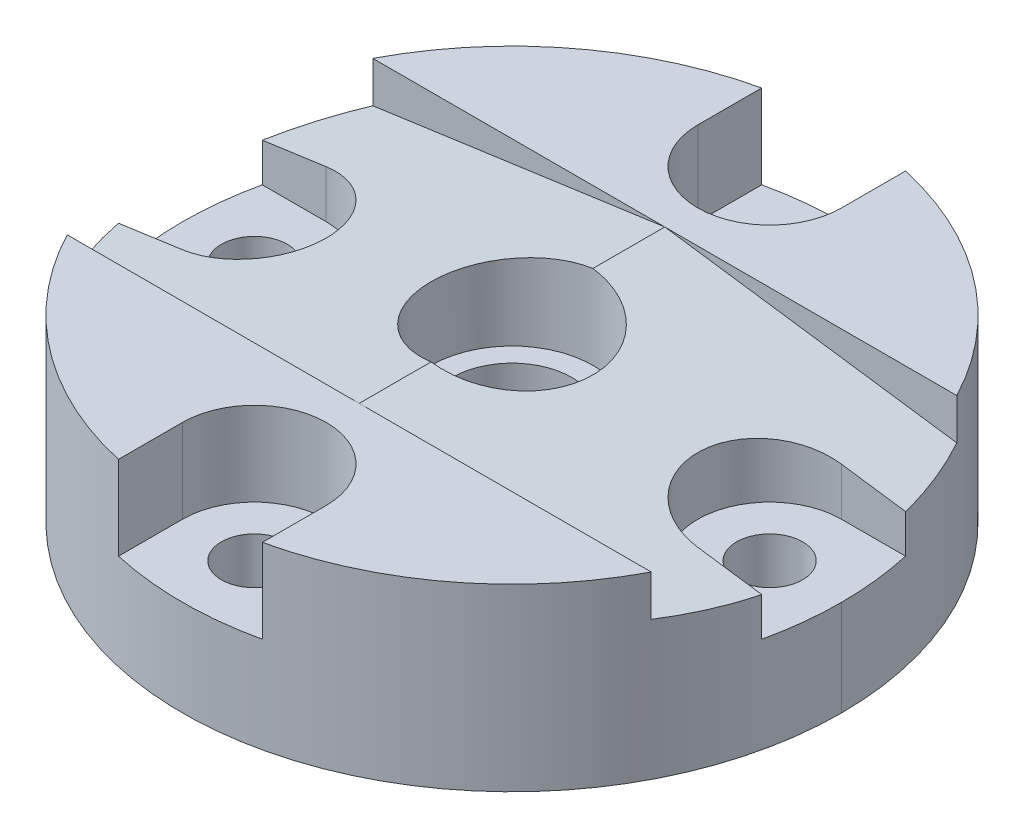
ISO-10303-21;
HEADER;
FILE_DESCRIPTION(('STEP AP214'),'2;1');
FILE_NAME('part.step','',(''),(''),'','','');
FILE_SCHEMA(('AUTOMOTIVE_DESIGN { 1 0 10303 214 1 1 1 1 }'));
ENDSEC;
DATA;
#1=APPLICATION_CONTEXT('core data for automotive mechanical design processes');
#2=APPLICATION_PROTOCOL_DEFINITION('international standard','automotive_design',2000,#1);
#3=PRODUCT_CONTEXT('',#1,'mechanical');
#4=PRODUCT('Part','Part','',(#3));
#5=PRODUCT_RELATED_PRODUCT_CATEGORY('part','',(#4));
#6=PRODUCT_DEFINITION_FORMATION('','',#4);
#7=PRODUCT_DEFINITION_CONTEXT('part definition',#1,'design');
#8=PRODUCT_DEFINITION('design','',#6,#7);
#9=PRODUCT_DEFINITION_SHAPE('','',#8);
#10=(LENGTH_UNIT() NAMED_UNIT(*) SI_UNIT(.MILLI.,.METRE.));
#11=(NAMED_UNIT(*) PLANE_ANGLE_UNIT() SI_UNIT($,.RADIAN.));
#12=(NAMED_UNIT(*) SI_UNIT($,.STERADIAN.) SOLID_ANGLE_UNIT());
#13=UNCERTAINTY_MEASURE_WITH_UNIT(LENGTH_MEASURE(1.E-05),#10,'distance_accuracy_value','');
#14=(GEOMETRIC_REPRESENTATION_CONTEXT(3) GLOBAL_UNCERTAINTY_ASSIGNED_CONTEXT((#13)) GLOBAL_UNIT_ASSIGNED_CONTEXT((#10,
#11,#12)) REPRESENTATION_CONTEXT('',''));
#15=CARTESIAN_POINT('',(0.,0.,0.));
#16=DIRECTION('',(0.,0.,1.));
#17=DIRECTION('',(1.,0.,0.));
#18=AXIS2_PLACEMENT_3D('',#15,#16,#17);
#19=CARTESIAN_POINT('',(3.06925697555866,21.8388981541077,25.5));
#20=DIRECTION('',(0.139173100960058,0.990268068741571,0.));
#21=DIRECTION('',(-0.990268068741571,0.139173100960058,0.));
#22=AXIS2_PLACEMENT_3D('',#19,#20,#21);
#23=PLANE('',#22);
#24=DIRECTION('',(0.,0.,-1.));
#25=VECTOR('',#24,1.);
#26=CARTESIAN_POINT('',(-55.,30.,25.5));
#27=LINE('',#26,#25);
#28=CARTESIAN_POINT('',(-55.,30.,-13.4999999999997));
#29=VERTEX_POINT('',#28);
#30=CARTESIAN_POINT('',(-55.,30.,-25.5));
#31=VERTEX_POINT('',#30);
#32=EDGE_CURVE('E245',#29,#31,#27,.T.);
#33=ORIENTED_EDGE('',*,*,#32,.F.);
#34=CARTESIAN_POINT('',(-55.,30.,3.02131005399295E-13));
#35=DIRECTION('',(0.139173100960058,0.990268068741571,0.));
#36=DIRECTION('',(0.990268068741571,-0.139173100960058,0.));
#37=AXIS2_PLACEMENT_3D('',#34,#35,#36);
#38=ELLIPSE('',#37,13.6326722290013,13.5);
#39=CARTESIAN_POINT('',(-54.9999999999999,30.,13.5000000000003));
#40=VERTEX_POINT('',#39);
#41=EDGE_CURVE('E90',#29,#40,#38,.F.);
#42=ORIENTED_EDGE('',*,*,#41,.T.);
#43=CARTESIAN_POINT('',(-55.,30.,25.5));
#44=VERTEX_POINT('',#43);
#45=EDGE_CURVE('E242',#44,#40,#27,.T.);
#46=ORIENTED_EDGE('',*,*,#45,.F.);
#47=DIRECTION('',(0.990268068741571,-0.139173100960058,0.));
#48=VECTOR('',#47,1.);
#49=CARTESIAN_POINT('',(3.06925697555866,21.8388981541077,25.5));
#50=LINE('',#49,#48);
#51=CARTESIAN_POINT('',(-6.26859328933752,23.1512474246621,25.5));
#52=VERTEX_POINT('',#51);
#53=EDGE_CURVE('E413',#44,#52,#50,.T.);
#54=ORIENTED_EDGE('',*,*,#53,.T.);
#55=CARTESIAN_POINT('',(-55.,30.,0.));
#56=DIRECTION('',(0.139173100960058,0.990268068741571,0.));
#57=DIRECTION('',(-0.990268068741571,0.139173100960058,0.));
#58=AXIS2_PLACEMENT_3D('',#55,#56,#57);
#59=ELLIPSE('',#58,55.5405164885239,55.);
#60=CARTESIAN_POINT('',(-1.3250523987214,22.4564780615096,11.9999999999998));
#61=VERTEX_POINT('',#60);
#62=EDGE_CURVE('E253',#61,#52,#59,.F.);
#63=ORIENTED_EDGE('',*,*,#62,.F.);
#64=DIRECTION('',(0.990268068741571,-0.139173100960058,0.));
#65=VECTOR('',#64,1.);
#66=CARTESIAN_POINT('',(3.06925697555864,21.8388981541077,11.9999999999998));
#67=LINE('',#66,#65);
#68=CARTESIAN_POINT('',(-12.,23.9567441077975,11.9999999999998));
#69=VERTEX_POINT('',#68);
#70=EDGE_CURVE('E289',#69,#61,#67,.T.);
#71=ORIENTED_EDGE('',*,*,#70,.F.);
#72=CARTESIAN_POINT('',(-12.,23.9567441077975,-1.66533453693773E-13));
#73=DIRECTION('',(0.139173100960058,0.990268068741571,0.));
#74=DIRECTION('',(-0.990268068741571,0.139173100960058,0.));
#75=AXIS2_PLACEMENT_3D('',#72,#73,#74);
#76=ELLIPSE('',#75,12.1179308702234,12.);
#77=CARTESIAN_POINT('',(-12.,23.9567441077975,-12.0000000000001));
#78=VERTEX_POINT('',#77);
#79=EDGE_CURVE('E287',#78,#69,#76,.T.);
#80=ORIENTED_EDGE('',*,*,#79,.F.);
#81=DIRECTION('',(-0.990268068741571,0.139173100960058,0.));
#82=VECTOR('',#81,1.);
#83=CARTESIAN_POINT('',(3.06925697555862,21.8388981541077,-12.0000000000002));
#84=LINE('',#83,#82);
#85=CARTESIAN_POINT('',(-1.32505239872145,22.4564780615096,-12.0000000000001));
#86=VERTEX_POINT('',#85);
#87=EDGE_CURVE('E291',#86,#78,#84,.T.);
#88=ORIENTED_EDGE('',*,*,#87,.F.);
#89=CARTESIAN_POINT('',(-55.,30.,0.));
#90=DIRECTION('',(-0.139173100960058,-0.990268068741571,0.));
#91=DIRECTION('',(-0.990268068741571,0.139173100960058,0.));
#92=AXIS2_PLACEMENT_3D('',#89,#90,#91);
#93=ELLIPSE('',#92,55.5405164885239,55.);
#94=CARTESIAN_POINT('',(-6.26859328933752,23.1512474246621,-25.5));
#95=VERTEX_POINT('',#94);
#96=EDGE_CURVE('E403',#86,#95,#93,.F.);
#97=ORIENTED_EDGE('',*,*,#96,.T.);
#98=DIRECTION('',(0.990268068741571,-0.139173100960058,0.));
#99=VECTOR('',#98,1.);
#100=CARTESIAN_POINT('',(3.06925697555866,21.8388981541077,-25.5));
#101=LINE('',#100,#99);
#102=EDGE_CURVE('E394',#31,#95,#101,.T.);
#103=ORIENTED_EDGE('',*,*,#102,.F.);
#104=EDGE_LOOP('',(#33,#42,#46,#54,#63,#71,#80,#88,#97,#103));
#105=FACE_BOUND('',#104,.T.);
#106=ADVANCED_FACE('F75',(#105),#23,.T.);
#107=CARTESIAN_POINT('',(-5.1998636989509,36.9989527240419,25.5));
#108=DIRECTION('',(-0.139173100960058,0.990268068741571,0.));
#109=DIRECTION('',(-0.990268068741571,-0.139173100960058,0.));
#110=AXIS2_PLACEMENT_3D('',#107,#108,#109);
#111=PLANE('',#110);
#112=ORIENTED_EDGE('',*,*,#45,.T.);
#113=CARTESIAN_POINT('',(-55.,30.,3.02131005399295E-13));
#114=DIRECTION('',(-0.139173100960058,0.990268068741571,0.));
#115=DIRECTION('',(-0.990268068741571,-0.139173100960058,0.));
#116=AXIS2_PLACEMENT_3D('',#113,#114,#115);
#117=ELLIPSE('',#116,13.6326722290013,13.5);
#118=EDGE_CURVE('E12',#40,#29,#117,.F.);
#119=ORIENTED_EDGE('',*,*,#118,.T.);
#120=ORIENTED_EDGE('',*,*,#32,.T.);
#121=DIRECTION('',(0.990268068741571,0.139173100960058,0.));
#122=VECTOR('',#121,1.);
#123=CARTESIAN_POINT('',(-5.1998636989509,36.9989527240419,-25.5));
#124=LINE('',#123,#122);
#125=CARTESIAN_POINT('',(-103.731406710662,23.1512474246621,-25.5));
#126=VERTEX_POINT('',#125);
#127=EDGE_CURVE('E382',#126,#31,#124,.T.);
#128=ORIENTED_EDGE('',*,*,#127,.F.);
#129=CARTESIAN_POINT('',(-55.,30.,0.));
#130=DIRECTION('',(0.139173100960058,-0.990268068741571,0.));
#131=DIRECTION('',(0.990268068741571,0.139173100960058,0.));
#132=AXIS2_PLACEMENT_3D('',#129,#130,#131);
#133=ELLIPSE('',#132,55.5405164885239,55.);
#134=CARTESIAN_POINT('',(-108.674947601279,22.4564780615096,-11.9999999999993));
#135=VERTEX_POINT('',#134);
#136=EDGE_CURVE('E388',#126,#135,#133,.F.);
#137=ORIENTED_EDGE('',*,*,#136,.T.);
#138=DIRECTION('',(-0.990268068741571,-0.139173100960058,0.));
#139=VECTOR('',#138,1.);
#140=CARTESIAN_POINT('',(-5.19986369895145,36.9989527240418,-12.0000000000009));
#141=LINE('',#140,#139);
#142=CARTESIAN_POINT('',(-98.0000000000001,23.9567441077975,-11.9999999999995));
#143=VERTEX_POINT('',#142);
#144=EDGE_CURVE('E285',#143,#135,#141,.T.);
#145=ORIENTED_EDGE('',*,*,#144,.F.);
#146=CARTESIAN_POINT('',(-98.,23.9567441077975,4.78783679369599E-13));
#147=DIRECTION('',(-0.139173100960058,0.990268068741571,0.));
#148=DIRECTION('',(0.990268068741571,0.139173100960058,0.));
#149=AXIS2_PLACEMENT_3D('',#146,#147,#148);
#150=ELLIPSE('',#149,12.1179308702234,12.);
#151=CARTESIAN_POINT('',(-97.9999999999999,23.9567441077975,12.0000000000005));
#152=VERTEX_POINT('',#151);
#153=EDGE_CURVE('E283',#152,#143,#150,.T.);
#154=ORIENTED_EDGE('',*,*,#153,.F.);
#155=DIRECTION('',(0.990268068741571,0.139173100960058,0.));
#156=VECTOR('',#155,1.);
#157=CARTESIAN_POINT('',(-5.19986369895108,36.9989527240419,11.9999999999992));
#158=LINE('',#157,#156);
#159=CARTESIAN_POINT('',(-108.674947601278,22.4564780615096,12.0000000000006));
#160=VERTEX_POINT('',#159);
#161=EDGE_CURVE('E281',#160,#152,#158,.T.);
#162=ORIENTED_EDGE('',*,*,#161,.F.);
#163=CARTESIAN_POINT('',(-55.,30.,0.));
#164=DIRECTION('',(-0.139173100960058,0.990268068741571,0.));
#165=DIRECTION('',(0.990268068741571,0.139173100960058,0.));
#166=AXIS2_PLACEMENT_3D('',#163,#164,#165);
#167=ELLIPSE('',#166,55.5405164885239,55.);
#168=CARTESIAN_POINT('',(-103.731406710662,23.1512474246621,25.5));
#169=VERTEX_POINT('',#168);
#170=EDGE_CURVE('E408',#169,#160,#167,.F.);
#171=ORIENTED_EDGE('',*,*,#170,.F.);
#172=DIRECTION('',(0.990268068741571,0.139173100960058,0.));
#173=VECTOR('',#172,1.);
#174=CARTESIAN_POINT('',(-5.1998636989509,36.9989527240419,25.5));
#175=LINE('',#174,#173);
#176=EDGE_CURVE('E252',#169,#44,#175,.T.);
#177=ORIENTED_EDGE('',*,*,#176,.T.);
#178=EDGE_LOOP('',(#112,#119,#120,#128,#137,#145,#154,#162,#171,#177));
#179=FACE_BOUND('',#178,.T.);
#180=ADVANCED_FACE('F250',(#179),#111,.T.);
#181=CARTESIAN_POINT('',(0.,30.,-55.));
#182=DIRECTION('',(0.,1.,0.));
#183=DIRECTION('',(-1.,0.,0.));
#184=AXIS2_PLACEMENT_3D('',#181,#182,#183);
#185=PLANE('',#184);
#186=DIRECTION('',(0.,0.,-1.));
#187=VECTOR('',#186,1.);
#188=CARTESIAN_POINT('',(-43.0000000000005,30.,-55.0000000000001));
#189=LINE('',#188,#187);
#190=CARTESIAN_POINT('',(-43.0000000000003,30.,-43.0000000000001));
#191=VERTEX_POINT('',#190);
#192=CARTESIAN_POINT('',(-43.0000000000004,30.,-53.6749476012787));
#193=VERTEX_POINT('',#192);
#194=EDGE_CURVE('E312',#191,#193,#189,.T.);
#195=ORIENTED_EDGE('',*,*,#194,.F.);
#196=CARTESIAN_POINT('',(-55.0000000000003,30.,-43.));
#197=DIRECTION('',(0.,1.,0.));
#198=DIRECTION('',(-1.,0.,0.));
#199=AXIS2_PLACEMENT_3D('',#196,#197,#198);
#200=CIRCLE('',#199,12.);
#201=CARTESIAN_POINT('',(-67.0000000000003,30.,-42.9999999999999));
#202=VERTEX_POINT('',#201);
#203=EDGE_CURVE('E329',#202,#191,#200,.T.);
#204=ORIENTED_EDGE('',*,*,#203,.F.);
#205=DIRECTION('',(0.,0.,1.));
#206=VECTOR('',#205,1.);
#207=CARTESIAN_POINT('',(-67.0000000000004,30.,-54.9999999999999));
#208=LINE('',#207,#206);
#209=CARTESIAN_POINT('',(-67.0000000000004,30.,-53.6749476012785));
#210=VERTEX_POINT('',#209);
#211=EDGE_CURVE('E482',#210,#202,#208,.T.);
#212=ORIENTED_EDGE('',*,*,#211,.F.);
#213=CARTESIAN_POINT('',(-55.,30.,0.));
#214=DIRECTION('',(0.,1.,0.));
#215=DIRECTION('',(-1.,0.,0.));
#216=AXIS2_PLACEMENT_3D('',#213,#214,#215);
#217=CIRCLE('',#216,55.);
#218=CARTESIAN_POINT('',(-103.731406710662,30.,-25.5));
#219=VERTEX_POINT('',#218);
#220=EDGE_CURVE('E277',#210,#219,#217,.T.);
#221=ORIENTED_EDGE('',*,*,#220,.T.);
#222=DIRECTION('',(1.,0.,0.));
#223=VECTOR('',#222,1.);
#224=CARTESIAN_POINT('',(0.,30.,-25.5));
#225=LINE('',#224,#223);
#226=EDGE_CURVE('E385',#219,#31,#225,.T.);
#227=ORIENTED_EDGE('',*,*,#226,.T.);
#228=DIRECTION('',(1.,0.,0.));
#229=VECTOR('',#228,1.);
#230=CARTESIAN_POINT('',(0.,30.,-25.5));
#231=LINE('',#230,#229);
#232=CARTESIAN_POINT('',(-6.26859328933752,30.,-25.5));
#233=VERTEX_POINT('',#232);
#234=EDGE_CURVE('E397',#31,#233,#231,.T.);
#235=ORIENTED_EDGE('',*,*,#234,.T.);
#236=EDGE_CURVE('E278',#233,#193,#217,.T.);
#237=ORIENTED_EDGE('',*,*,#236,.T.);
#238=EDGE_LOOP('',(#195,#204,#212,#221,#227,#235,#237));
#239=FACE_BOUND('',#238,.T.);
#240=ADVANCED_FACE('F449',(#239),#185,.T.);
#241=CARTESIAN_POINT('',(-55.,0.,0.));
#242=DIRECTION('',(0.,1.,0.));
#243=DIRECTION('',(0.,0.,1.));
#244=AXIS2_PLACEMENT_3D('',#241,#242,#243);
#245=CYLINDRICAL_SURFACE('',#244,55.);
#246=DIRECTION('',(0.,1.,0.));
#247=VECTOR('',#246,1.);
#248=CARTESIAN_POINT('',(-43.0000000000004,0.,-53.6749476012787));
#249=LINE('',#248,#247);
#250=CARTESIAN_POINT('',(-43.0000000000004,16.,-53.6749476012787));
#251=VERTEX_POINT('',#250);
#252=EDGE_CURVE('E84',#193,#251,#249,.F.);
#253=ORIENTED_EDGE('',*,*,#252,.F.);
#254=ORIENTED_EDGE('',*,*,#236,.F.);
#255=DIRECTION('',(0.,1.,0.));
#256=VECTOR('',#255,1.);
#257=CARTESIAN_POINT('',(-6.26859328933752,0.,-25.5));
#258=LINE('',#257,#256);
#259=EDGE_CURVE('E400',#233,#95,#258,.F.);
#260=ORIENTED_EDGE('',*,*,#259,.T.);
#261=ORIENTED_EDGE('',*,*,#96,.F.);
#262=DIRECTION('',(0.,1.,0.));
#263=VECTOR('',#262,1.);
#264=CARTESIAN_POINT('',(-1.32505239872147,0.,-12.0000000000001));
#265=LINE('',#264,#263);
#266=CARTESIAN_POINT('',(-1.32505239872147,16.,-12.0000000000001));
#267=VERTEX_POINT('',#266);
#268=EDGE_CURVE('E370',#267,#86,#265,.T.);
#269=ORIENTED_EDGE('',*,*,#268,.F.);
#270=CARTESIAN_POINT('',(-55.,16.,0.));
#271=DIRECTION('',(0.,-1.,0.));
#272=DIRECTION('',(1.,0.,0.));
#273=AXIS2_PLACEMENT_3D('',#270,#271,#272);
#274=CIRCLE('',#273,55.);
#275=CARTESIAN_POINT('',(0.,16.,-1.74917950494328E-13));
#276=VERTEX_POINT('',#275);
#277=EDGE_CURVE('E380',#276,#267,#274,.F.);
#278=ORIENTED_EDGE('',*,*,#277,.F.);
#279=DIRECTION('',(0.,1.,0.));
#280=VECTOR('',#279,1.);
#281=CARTESIAN_POINT('',(0.,0.,0.));
#282=LINE('',#281,#280);
#283=CARTESIAN_POINT('',(0.,0.,0.));
#284=VERTEX_POINT('',#283);
#285=EDGE_CURVE('E263',#284,#276,#282,.T.);
#286=ORIENTED_EDGE('',*,*,#285,.F.);
#287=CARTESIAN_POINT('',(-55.,0.,0.));
#288=DIRECTION('',(0.,1.,0.));
#289=DIRECTION('',(0.,0.,1.));
#290=AXIS2_PLACEMENT_3D('',#287,#288,#289);
#291=CIRCLE('',#290,55.);
#292=CARTESIAN_POINT('',(-110.,0.,0.));
#293=VERTEX_POINT('',#292);
#294=EDGE_CURVE('E275',#293,#284,#291,.F.);
#295=ORIENTED_EDGE('',*,*,#294,.F.);
#296=DIRECTION('',(0.,-1.,0.));
#297=VECTOR('',#296,1.);
#298=CARTESIAN_POINT('',(-110.,0.,0.));
#299=LINE('',#298,#297);
#300=CARTESIAN_POINT('',(-110.,16.,6.04262010798589E-13));
#301=VERTEX_POINT('',#300);
#302=EDGE_CURVE('E266',#301,#293,#299,.T.);
#303=ORIENTED_EDGE('',*,*,#302,.F.);
#304=CARTESIAN_POINT('',(-55.,16.,0.));
#305=DIRECTION('',(0.,1.,0.));
#306=DIRECTION('',(-1.,0.,0.));
#307=AXIS2_PLACEMENT_3D('',#304,#305,#306);
#308=CIRCLE('',#307,55.);
#309=CARTESIAN_POINT('',(-108.674947601279,16.,-11.9999999999993));
#310=VERTEX_POINT('',#309);
#311=EDGE_CURVE('E377',#301,#310,#308,.F.);
#312=ORIENTED_EDGE('',*,*,#311,.T.);
#313=DIRECTION('',(0.,1.,0.));
#314=VECTOR('',#313,1.);
#315=CARTESIAN_POINT('',(-108.674947601279,0.,-11.9999999999993));
#316=LINE('',#315,#314);
#317=EDGE_CURVE('E365',#135,#310,#316,.F.);
#318=ORIENTED_EDGE('',*,*,#317,.F.);
#319=ORIENTED_EDGE('',*,*,#136,.F.);
#320=DIRECTION('',(0.,1.,0.));
#321=VECTOR('',#320,1.);
#322=CARTESIAN_POINT('',(-103.731406710662,0.,-25.5));
#323=LINE('',#322,#321);
#324=EDGE_CURVE('E391',#126,#219,#323,.T.);
#325=ORIENTED_EDGE('',*,*,#324,.T.);
#326=ORIENTED_EDGE('',*,*,#220,.F.);
#327=DIRECTION('',(0.,1.,0.));
#328=VECTOR('',#327,1.);
#329=CARTESIAN_POINT('',(-67.0000000000004,0.,-53.6749476012785));
#330=LINE('',#329,#328);
#331=CARTESIAN_POINT('',(-67.0000000000004,16.,-53.6749476012785));
#332=VERTEX_POINT('',#331);
#333=EDGE_CURVE('E307',#332,#210,#330,.T.);
#334=ORIENTED_EDGE('',*,*,#333,.F.);
#335=CARTESIAN_POINT('',(-55.,16.,0.));
#336=DIRECTION('',(0.,1.,0.));
#337=DIRECTION('',(-1.,0.,0.));
#338=AXIS2_PLACEMENT_3D('',#335,#336,#337);
#339=CIRCLE('',#338,55.);
#340=EDGE_CURVE('E304',#332,#251,#339,.F.);
#341=ORIENTED_EDGE('',*,*,#340,.T.);
#342=EDGE_LOOP('',(#253,#254,#260,#261,#269,#278,#286,#295,#303,#312,#318,#319,#325,#326,#334,#341));
#343=FACE_BOUND('',#342,.T.);
#344=ADVANCED_FACE('F78',(#343),#245,.T.);
#345=CARTESIAN_POINT('',(-55.,30.,0.));
#346=DIRECTION('',(0.,1.,0.));
#347=DIRECTION('',(0.,0.,1.));
#348=AXIS2_PLACEMENT_3D('',#345,#346,#347);
#349=CYLINDRICAL_SURFACE('',#348,55.);
#350=DIRECTION('',(0.,1.,0.));
#351=VECTOR('',#350,1.);
#352=CARTESIAN_POINT('',(-67.,30.,53.6749476012786));
#353=LINE('',#352,#351);
#354=CARTESIAN_POINT('',(-67.,30.,53.6749476012786));
#355=VERTEX_POINT('',#354);
#356=CARTESIAN_POINT('',(-67.,16.,53.6749476012786));
#357=VERTEX_POINT('',#356);
#358=EDGE_CURVE('E374',#355,#357,#353,.F.);
#359=ORIENTED_EDGE('',*,*,#358,.F.);
#360=CARTESIAN_POINT('',(-55.,30.,0.));
#361=DIRECTION('',(0.,-1.,0.));
#362=DIRECTION('',(1.,0.,0.));
#363=AXIS2_PLACEMENT_3D('',#360,#361,#362);
#364=CIRCLE('',#363,55.);
#365=CARTESIAN_POINT('',(-103.731406710662,30.,25.5));
#366=VERTEX_POINT('',#365);
#367=EDGE_CURVE('E269',#366,#355,#364,.F.);
#368=ORIENTED_EDGE('',*,*,#367,.F.);
#369=DIRECTION('',(0.,1.,0.));
#370=VECTOR('',#369,1.);
#371=CARTESIAN_POINT('',(-103.731406710662,30.,25.5));
#372=LINE('',#371,#370);
#373=EDGE_CURVE('E411',#366,#169,#372,.F.);
#374=ORIENTED_EDGE('',*,*,#373,.T.);
#375=ORIENTED_EDGE('',*,*,#170,.T.);
#376=DIRECTION('',(0.,1.,0.));
#377=VECTOR('',#376,1.);
#378=CARTESIAN_POINT('',(-108.674947601278,30.,12.0000000000006));
#379=LINE('',#378,#377);
#380=CARTESIAN_POINT('',(-108.674947601278,16.,12.0000000000006));
#381=VERTEX_POINT('',#380);
#382=EDGE_CURVE('E363',#381,#160,#379,.T.);
#383=ORIENTED_EDGE('',*,*,#382,.F.);
#384=CARTESIAN_POINT('',(-55.,16.,0.));
#385=DIRECTION('',(0.,1.,0.));
#386=DIRECTION('',(-1.,0.,0.));
#387=AXIS2_PLACEMENT_3D('',#384,#385,#386);
#388=CIRCLE('',#387,55.);
#389=EDGE_CURVE('E297',#381,#301,#388,.F.);
#390=ORIENTED_EDGE('',*,*,#389,.T.);
#391=ORIENTED_EDGE('',*,*,#302,.T.);
#392=CARTESIAN_POINT('',(-55.,0.,0.));
#393=DIRECTION('',(0.,1.,0.));
#394=DIRECTION('',(0.,0.,1.));
#395=AXIS2_PLACEMENT_3D('',#392,#393,#394);
#396=CIRCLE('',#395,55.);
#397=EDGE_CURVE('E272',#284,#293,#396,.F.);
#398=ORIENTED_EDGE('',*,*,#397,.F.);
#399=ORIENTED_EDGE('',*,*,#285,.T.);
#400=CARTESIAN_POINT('',(-55.,16.,0.));
#401=DIRECTION('',(0.,-1.,0.));
#402=DIRECTION('',(1.,0.,0.));
#403=AXIS2_PLACEMENT_3D('',#400,#401,#402);
#404=CIRCLE('',#403,55.);
#405=CARTESIAN_POINT('',(-1.32505239872139,16.,11.9999999999998));
#406=VERTEX_POINT('',#405);
#407=EDGE_CURVE('E300',#406,#276,#404,.F.);
#408=ORIENTED_EDGE('',*,*,#407,.F.);
#409=DIRECTION('',(0.,1.,0.));
#410=VECTOR('',#409,1.);
#411=CARTESIAN_POINT('',(-1.32505239872139,30.,11.9999999999998));
#412=LINE('',#411,#410);
#413=EDGE_CURVE('E368',#61,#406,#412,.F.);
#414=ORIENTED_EDGE('',*,*,#413,.F.);
#415=ORIENTED_EDGE('',*,*,#62,.T.);
#416=DIRECTION('',(0.,1.,0.));
#417=VECTOR('',#416,1.);
#418=CARTESIAN_POINT('',(-6.26859328933752,30.,25.5));
#419=LINE('',#418,#417);
#420=CARTESIAN_POINT('',(-6.26859328933752,30.,25.5));
#421=VERTEX_POINT('',#420);
#422=EDGE_CURVE('E255',#52,#421,#419,.T.);
#423=ORIENTED_EDGE('',*,*,#422,.T.);
#424=CARTESIAN_POINT('',(-43.,30.,53.6749476012786));
#425=VERTEX_POINT('',#424);
#426=EDGE_CURVE('E268',#425,#421,#364,.F.);
#427=ORIENTED_EDGE('',*,*,#426,.F.);
#428=DIRECTION('',(0.,1.,0.));
#429=VECTOR('',#428,1.);
#430=CARTESIAN_POINT('',(-43.,30.,53.6749476012786));
#431=LINE('',#430,#429);
#432=CARTESIAN_POINT('',(-43.,16.,53.6749476012786));
#433=VERTEX_POINT('',#432);
#434=EDGE_CURVE('E372',#433,#425,#431,.T.);
#435=ORIENTED_EDGE('',*,*,#434,.F.);
#436=CARTESIAN_POINT('',(-55.,16.,0.));
#437=DIRECTION('',(0.,-1.,0.));
#438=DIRECTION('',(1.,0.,0.));
#439=AXIS2_PLACEMENT_3D('',#436,#437,#438);
#440=CIRCLE('',#439,55.);
#441=EDGE_CURVE('E302',#357,#433,#440,.F.);
#442=ORIENTED_EDGE('',*,*,#441,.F.);
#443=EDGE_LOOP('',(#359,#368,#374,#375,#383,#390,#391,#398,#399,#408,#414,#415,#423,#427,#435,#442));
#444=FACE_BOUND('',#443,.T.);
#445=ADVANCED_FACE('F425',(#444),#349,.T.);
#446=CARTESIAN_POINT('',(0.,30.,55.));
#447=DIRECTION('',(0.,-1.,0.));
#448=DIRECTION('',(1.,0.,0.));
#449=AXIS2_PLACEMENT_3D('',#446,#447,#448);
#450=PLANE('',#449);
#451=ORIENTED_EDGE('',*,*,#367,.T.);
#452=DIRECTION('',(0.,0.,1.));
#453=VECTOR('',#452,1.);
#454=CARTESIAN_POINT('',(-67.,30.,55.));
#455=LINE('',#454,#453);
#456=CARTESIAN_POINT('',(-67.,30.,43.));
#457=VERTEX_POINT('',#456);
#458=EDGE_CURVE('E478',#457,#355,#455,.T.);
#459=ORIENTED_EDGE('',*,*,#458,.F.);
#460=CARTESIAN_POINT('',(-55.,30.,43.));
#461=DIRECTION('',(0.,1.,0.));
#462=DIRECTION('',(1.,0.,0.));
#463=AXIS2_PLACEMENT_3D('',#460,#461,#462);
#464=CIRCLE('',#463,12.);
#465=CARTESIAN_POINT('',(-43.,30.,43.));
#466=VERTEX_POINT('',#465);
#467=EDGE_CURVE('E480',#466,#457,#464,.T.);
#468=ORIENTED_EDGE('',*,*,#467,.F.);
#469=DIRECTION('',(0.,0.,1.));
#470=VECTOR('',#469,1.);
#471=CARTESIAN_POINT('',(-43.,30.,55.));
#472=LINE('',#471,#470);
#473=EDGE_CURVE('E294',#466,#425,#472,.T.);
#474=ORIENTED_EDGE('',*,*,#473,.T.);
#475=ORIENTED_EDGE('',*,*,#426,.T.);
#476=DIRECTION('',(1.,0.,0.));
#477=VECTOR('',#476,1.);
#478=CARTESIAN_POINT('',(0.,30.,25.5));
#479=LINE('',#478,#477);
#480=EDGE_CURVE('E257',#44,#421,#479,.T.);
#481=ORIENTED_EDGE('',*,*,#480,.F.);
#482=DIRECTION('',(1.,0.,0.));
#483=VECTOR('',#482,1.);
#484=CARTESIAN_POINT('',(0.,30.,25.5));
#485=LINE('',#484,#483);
#486=EDGE_CURVE('E406',#366,#44,#485,.T.);
#487=ORIENTED_EDGE('',*,*,#486,.F.);
#488=EDGE_LOOP('',(#451,#459,#468,#474,#475,#481,#487));
#489=FACE_BOUND('',#488,.T.);
#490=ADVANCED_FACE('F475',(#489),#450,.F.);
#491=CARTESIAN_POINT('',(0.,0.,55.));
#492=DIRECTION('',(0.,1.,0.));
#493=DIRECTION('',(0.,0.,1.));
#494=AXIS2_PLACEMENT_3D('',#491,#492,#493);
#495=PLANE('',#494);
#496=CARTESIAN_POINT('',(-55.,0.,3.02275565688959E-13));
#497=DIRECTION('',(0.,1.,0.));
#498=DIRECTION('',(-1.,0.,0.));
#499=AXIS2_PLACEMENT_3D('',#496,#497,#498);
#500=CIRCLE('',#499,10.);
#501=CARTESIAN_POINT('',(-65.,0.,3.02275565688959E-13));
#502=VERTEX_POINT('',#501);
#503=EDGE_CURVE('E802',#502,#502,#500,.T.);
#504=ORIENTED_EDGE('',*,*,#503,.T.);
#505=EDGE_LOOP('',(#504));
#506=FACE_BOUND('',#505,.T.);
#507=CARTESIAN_POINT('',(-12.,0.,-1.66533453693773E-13));
#508=DIRECTION('',(0.,1.,0.));
#509=DIRECTION('',(-1.,0.,0.));
#510=AXIS2_PLACEMENT_3D('',#507,#508,#509);
#511=CIRCLE('',#510,5.5);
#512=CARTESIAN_POINT('',(-17.5,0.,-1.66533453693773E-13));
#513=VERTEX_POINT('',#512);
#514=EDGE_CURVE('E356',#513,#513,#511,.T.);
#515=ORIENTED_EDGE('',*,*,#514,.T.);
#516=EDGE_LOOP('',(#515));
#517=FACE_BOUND('',#516,.T.);
#518=CARTESIAN_POINT('',(-98.,0.,-1.66533453693773E-13));
#519=DIRECTION('',(0.,1.,0.));
#520=DIRECTION('',(1.,0.,0.));
#521=AXIS2_PLACEMENT_3D('',#518,#519,#520);
#522=CIRCLE('',#521,5.5);
#523=CARTESIAN_POINT('',(-92.5,0.,-1.66533453693773E-13));
#524=VERTEX_POINT('',#523);
#525=EDGE_CURVE('E819',#524,#524,#522,.T.);
#526=ORIENTED_EDGE('',*,*,#525,.T.);
#527=EDGE_LOOP('',(#526));
#528=FACE_BOUND('',#527,.T.);
#529=CARTESIAN_POINT('',(-54.9999999999997,0.,43.));
#530=DIRECTION('',(0.,1.,0.));
#531=DIRECTION('',(-1.,0.,0.));
#532=AXIS2_PLACEMENT_3D('',#529,#530,#531);
#533=CIRCLE('',#532,5.50000000000001);
#534=CARTESIAN_POINT('',(-60.4999999999997,0.,43.));
#535=VERTEX_POINT('',#534);
#536=EDGE_CURVE('E825',#535,#535,#533,.T.);
#537=ORIENTED_EDGE('',*,*,#536,.T.);
#538=EDGE_LOOP('',(#537));
#539=FACE_BOUND('',#538,.T.);
#540=CARTESIAN_POINT('',(-55.,0.,-43.));
#541=DIRECTION('',(0.,1.,0.));
#542=DIRECTION('',(1.,0.,0.));
#543=AXIS2_PLACEMENT_3D('',#540,#541,#542);
#544=CIRCLE('',#543,5.50000000000001);
#545=CARTESIAN_POINT('',(-49.5,0.,-43.));
#546=VERTEX_POINT('',#545);
#547=EDGE_CURVE('E246',#546,#546,#544,.T.);
#548=ORIENTED_EDGE('',*,*,#547,.T.);
#549=EDGE_LOOP('',(#548));
#550=FACE_BOUND('',#549,.T.);
#551=ORIENTED_EDGE('',*,*,#397,.T.);
#552=ORIENTED_EDGE('',*,*,#294,.T.);
#553=EDGE_LOOP('',(#551,#552));
#554=FACE_BOUND('',#553,.T.);
#555=ADVANCED_FACE('F518',(#506,#517,#528,#539,#550,#554),#495,.F.);
#556=CARTESIAN_POINT('',(0.,0.,25.5));
#557=DIRECTION('',(0.,0.,-1.));
#558=DIRECTION('',(-1.,0.,0.));
#559=AXIS2_PLACEMENT_3D('',#556,#557,#558);
#560=PLANE('',#559);
#561=ORIENTED_EDGE('',*,*,#53,.F.);
#562=ORIENTED_EDGE('',*,*,#480,.T.);
#563=ORIENTED_EDGE('',*,*,#422,.F.);
#564=EDGE_LOOP('',(#561,#562,#563));
#565=FACE_BOUND('',#564,.T.);
#566=ADVANCED_FACE('F419',(#565),#560,.T.);
#567=CARTESIAN_POINT('',(0.,0.,25.5));
#568=DIRECTION('',(0.,0.,-1.));
#569=DIRECTION('',(-1.,0.,0.));
#570=AXIS2_PLACEMENT_3D('',#567,#568,#569);
#571=PLANE('',#570);
#572=ORIENTED_EDGE('',*,*,#486,.T.);
#573=ORIENTED_EDGE('',*,*,#176,.F.);
#574=ORIENTED_EDGE('',*,*,#373,.F.);
#575=EDGE_LOOP('',(#572,#573,#574));
#576=FACE_BOUND('',#575,.T.);
#577=ADVANCED_FACE('F474',(#576),#571,.T.);
#578=CARTESIAN_POINT('',(0.,0.,-25.5));
#579=DIRECTION('',(0.,0.,1.));
#580=DIRECTION('',(-1.,0.,0.));
#581=AXIS2_PLACEMENT_3D('',#578,#579,#580);
#582=PLANE('',#581);
#583=ORIENTED_EDGE('',*,*,#234,.F.);
#584=ORIENTED_EDGE('',*,*,#102,.T.);
#585=ORIENTED_EDGE('',*,*,#259,.F.);
#586=EDGE_LOOP('',(#583,#584,#585));
#587=FACE_BOUND('',#586,.T.);
#588=ADVANCED_FACE('F447',(#587),#582,.T.);
#589=CARTESIAN_POINT('',(0.,0.,-25.5));
#590=DIRECTION('',(0.,0.,1.));
#591=DIRECTION('',(-1.,0.,0.));
#592=AXIS2_PLACEMENT_3D('',#589,#590,#591);
#593=PLANE('',#592);
#594=ORIENTED_EDGE('',*,*,#127,.T.);
#595=ORIENTED_EDGE('',*,*,#226,.F.);
#596=ORIENTED_EDGE('',*,*,#324,.F.);
#597=EDGE_LOOP('',(#594,#595,#596));
#598=FACE_BOUND('',#597,.T.);
#599=ADVANCED_FACE('F452',(#598),#593,.T.);
#600=CARTESIAN_POINT('',(-110.,16.,-11.9999999999993));
#601=DIRECTION('',(0.,0.,-1.));
#602=DIRECTION('',(-1.,0.,0.));
#603=AXIS2_PLACEMENT_3D('',#600,#601,#602);
#604=PLANE('',#603);
#605=ORIENTED_EDGE('',*,*,#317,.T.);
#606=DIRECTION('',(-1.,0.,0.));
#607=VECTOR('',#606,1.);
#608=CARTESIAN_POINT('',(-110.,16.,-11.9999999999993));
#609=LINE('',#608,#607);
#610=CARTESIAN_POINT('',(-98.0000000000001,16.,-11.9999999999995));
#611=VERTEX_POINT('',#610);
#612=EDGE_CURVE('E352',#611,#310,#609,.T.);
#613=ORIENTED_EDGE('',*,*,#612,.F.);
#614=DIRECTION('',(0.,1.,0.));
#615=VECTOR('',#614,1.);
#616=CARTESIAN_POINT('',(-98.0000000000001,16.,-11.9999999999995));
#617=LINE('',#616,#615);
#618=EDGE_CURVE('E353',#611,#143,#617,.T.);
#619=ORIENTED_EDGE('',*,*,#618,.T.);
#620=ORIENTED_EDGE('',*,*,#144,.T.);
#621=EDGE_LOOP('',(#605,#613,#619,#620));
#622=FACE_BOUND('',#621,.T.);
#623=ADVANCED_FACE('F460',(#622),#604,.F.);
#624=CARTESIAN_POINT('',(-98.,16.,4.78783679369599E-13));
#625=DIRECTION('',(0.,1.,0.));
#626=DIRECTION('',(-1.,0.,0.));
#627=AXIS2_PLACEMENT_3D('',#624,#625,#626);
#628=CYLINDRICAL_SURFACE('',#627,12.);
#629=ORIENTED_EDGE('',*,*,#153,.T.);
#630=ORIENTED_EDGE('',*,*,#618,.F.);
#631=CARTESIAN_POINT('',(-98.,16.,4.78783679369599E-13));
#632=DIRECTION('',(0.,1.,0.));
#633=DIRECTION('',(-1.,0.,0.));
#634=AXIS2_PLACEMENT_3D('',#631,#632,#633);
#635=CIRCLE('',#634,12.);
#636=CARTESIAN_POINT('',(-97.9999999999999,16.,12.0000000000005));
#637=VERTEX_POINT('',#636);
#638=EDGE_CURVE('E359',#637,#611,#635,.T.);
#639=ORIENTED_EDGE('',*,*,#638,.F.);
#640=DIRECTION('',(0.,1.,0.));
#641=VECTOR('',#640,1.);
#642=CARTESIAN_POINT('',(-97.9999999999999,16.,12.0000000000005));
#643=LINE('',#642,#641);
#644=EDGE_CURVE('E349',#637,#152,#643,.T.);
#645=ORIENTED_EDGE('',*,*,#644,.T.);
#646=EDGE_LOOP('',(#629,#630,#639,#645));
#647=FACE_BOUND('',#646,.T.);
#648=ADVANCED_FACE('F464',(#647),#628,.F.);
#649=CARTESIAN_POINT('',(-110.,16.,12.0000000000006));
#650=DIRECTION('',(0.,0.,1.));
#651=DIRECTION('',(1.,0.,0.));
#652=AXIS2_PLACEMENT_3D('',#649,#650,#651);
#653=PLANE('',#652);
#654=ORIENTED_EDGE('',*,*,#382,.T.);
#655=ORIENTED_EDGE('',*,*,#161,.T.);
#656=ORIENTED_EDGE('',*,*,#644,.F.);
#657=DIRECTION('',(1.,0.,0.));
#658=VECTOR('',#657,1.);
#659=CARTESIAN_POINT('',(-110.,16.,12.0000000000006));
#660=LINE('',#659,#658);
#661=EDGE_CURVE('E340',#381,#637,#660,.T.);
#662=ORIENTED_EDGE('',*,*,#661,.F.);
#663=EDGE_LOOP('',(#654,#655,#656,#662));
#664=FACE_BOUND('',#663,.T.);
#665=ADVANCED_FACE('F471',(#664),#653,.F.);
#666=CARTESIAN_POINT('',(-98.,16.,4.78783679369599E-13));
#667=DIRECTION('',(0.,1.,0.));
#668=DIRECTION('',(-1.,0.,0.));
#669=AXIS2_PLACEMENT_3D('',#666,#667,#668);
#670=PLANE('',#669);
#671=CARTESIAN_POINT('',(-98.,16.,-1.66533453693773E-13));
#672=DIRECTION('',(0.,1.,0.));
#673=DIRECTION('',(1.,0.,0.));
#674=AXIS2_PLACEMENT_3D('',#671,#672,#673);
#675=CIRCLE('',#674,5.5);
#676=CARTESIAN_POINT('',(-92.5,16.,-1.66533453693773E-13));
#677=VERTEX_POINT('',#676);
#678=EDGE_CURVE('E816',#677,#677,#675,.T.);
#679=ORIENTED_EDGE('',*,*,#678,.F.);
#680=EDGE_LOOP('',(#679));
#681=FACE_BOUND('',#680,.T.);
#682=ORIENTED_EDGE('',*,*,#389,.F.);
#683=ORIENTED_EDGE('',*,*,#661,.T.);
#684=ORIENTED_EDGE('',*,*,#638,.T.);
#685=ORIENTED_EDGE('',*,*,#612,.T.);
#686=ORIENTED_EDGE('',*,*,#311,.F.);
#687=EDGE_LOOP('',(#682,#683,#684,#685,#686));
#688=FACE_BOUND('',#687,.T.);
#689=ADVANCED_FACE('F466',(#681,#688),#670,.T.);
#690=CARTESIAN_POINT('',(0.,16.,-12.0000000000001));
#691=DIRECTION('',(0.,0.,-1.));
#692=DIRECTION('',(-1.,0.,0.));
#693=AXIS2_PLACEMENT_3D('',#690,#691,#692);
#694=PLANE('',#693);
#695=ORIENTED_EDGE('',*,*,#268,.T.);
#696=ORIENTED_EDGE('',*,*,#87,.T.);
#697=DIRECTION('',(0.,1.,0.));
#698=VECTOR('',#697,1.);
#699=CARTESIAN_POINT('',(-12.,16.,-12.0000000000001));
#700=LINE('',#699,#698);
#701=CARTESIAN_POINT('',(-12.,16.,-12.0000000000001));
#702=VERTEX_POINT('',#701);
#703=EDGE_CURVE('E334',#702,#78,#700,.T.);
#704=ORIENTED_EDGE('',*,*,#703,.F.);
#705=DIRECTION('',(-1.,0.,0.));
#706=VECTOR('',#705,1.);
#707=CARTESIAN_POINT('',(0.,16.,-12.0000000000001));
#708=LINE('',#707,#706);
#709=EDGE_CURVE('E346',#267,#702,#708,.T.);
#710=ORIENTED_EDGE('',*,*,#709,.F.);
#711=EDGE_LOOP('',(#695,#696,#704,#710));
#712=FACE_BOUND('',#711,.T.);
#713=ADVANCED_FACE('F441',(#712),#694,.F.);
#714=CARTESIAN_POINT('',(0.,16.,11.9999999999998));
#715=DIRECTION('',(0.,0.,1.));
#716=DIRECTION('',(1.,0.,0.));
#717=AXIS2_PLACEMENT_3D('',#714,#715,#716);
#718=PLANE('',#717);
#719=ORIENTED_EDGE('',*,*,#413,.T.);
#720=DIRECTION('',(1.,0.,0.));
#721=VECTOR('',#720,1.);
#722=CARTESIAN_POINT('',(0.,16.,11.9999999999998));
#723=LINE('',#722,#721);
#724=CARTESIAN_POINT('',(-12.,16.,11.9999999999998));
#725=VERTEX_POINT('',#724);
#726=EDGE_CURVE('E336',#725,#406,#723,.T.);
#727=ORIENTED_EDGE('',*,*,#726,.F.);
#728=DIRECTION('',(0.,1.,0.));
#729=VECTOR('',#728,1.);
#730=CARTESIAN_POINT('',(-12.,16.,11.9999999999998));
#731=LINE('',#730,#729);
#732=EDGE_CURVE('E337',#725,#69,#731,.T.);
#733=ORIENTED_EDGE('',*,*,#732,.T.);
#734=ORIENTED_EDGE('',*,*,#70,.T.);
#735=EDGE_LOOP('',(#719,#727,#733,#734));
#736=FACE_BOUND('',#735,.T.);
#737=ADVANCED_FACE('F433',(#736),#718,.F.);
#738=CARTESIAN_POINT('',(-12.,16.,-1.66533453693773E-13));
#739=DIRECTION('',(0.,1.,0.));
#740=DIRECTION('',(-1.,0.,0.));
#741=AXIS2_PLACEMENT_3D('',#738,#739,#740);
#742=CYLINDRICAL_SURFACE('',#741,12.);
#743=ORIENTED_EDGE('',*,*,#79,.T.);
#744=ORIENTED_EDGE('',*,*,#732,.F.);
#745=CARTESIAN_POINT('',(-12.,16.,-1.66533453693773E-13));
#746=DIRECTION('',(0.,1.,0.));
#747=DIRECTION('',(1.,0.,0.));
#748=AXIS2_PLACEMENT_3D('',#745,#746,#747);
#749=CIRCLE('',#748,12.);
#750=EDGE_CURVE('E343',#702,#725,#749,.T.);
#751=ORIENTED_EDGE('',*,*,#750,.F.);
#752=ORIENTED_EDGE('',*,*,#703,.T.);
#753=EDGE_LOOP('',(#743,#744,#751,#752));
#754=FACE_BOUND('',#753,.T.);
#755=ADVANCED_FACE('F437',(#754),#742,.F.);
#756=CARTESIAN_POINT('',(-12.,16.,-1.66533453693773E-13));
#757=DIRECTION('',(0.,-1.,0.));
#758=DIRECTION('',(1.,0.,0.));
#759=AXIS2_PLACEMENT_3D('',#756,#757,#758);
#760=PLANE('',#759);
#761=CARTESIAN_POINT('',(-12.,16.,-1.66533453693773E-13));
#762=DIRECTION('',(0.,1.,0.));
#763=DIRECTION('',(-1.,0.,0.));
#764=AXIS2_PLACEMENT_3D('',#761,#762,#763);
#765=CIRCLE('',#764,5.5);
#766=CARTESIAN_POINT('',(-17.5,16.,-1.66533453693773E-13));
#767=VERTEX_POINT('',#766);
#768=EDGE_CURVE('E813',#767,#767,#765,.T.);
#769=ORIENTED_EDGE('',*,*,#768,.F.);
#770=EDGE_LOOP('',(#769));
#771=FACE_BOUND('',#770,.T.);
#772=ORIENTED_EDGE('',*,*,#277,.T.);
#773=ORIENTED_EDGE('',*,*,#709,.T.);
#774=ORIENTED_EDGE('',*,*,#750,.T.);
#775=ORIENTED_EDGE('',*,*,#726,.T.);
#776=ORIENTED_EDGE('',*,*,#407,.T.);
#777=EDGE_LOOP('',(#772,#773,#774,#775,#776));
#778=FACE_BOUND('',#777,.T.);
#779=ADVANCED_FACE('F618',(#771,#778),#760,.F.);
#780=CARTESIAN_POINT('',(-67.,16.,55.));
#781=DIRECTION('',(-1.,0.,0.));
#782=DIRECTION('',(0.,-1.,0.));
#783=AXIS2_PLACEMENT_3D('',#780,#781,#782);
#784=PLANE('',#783);
#785=ORIENTED_EDGE('',*,*,#358,.T.);
#786=DIRECTION('',(0.,0.,1.));
#787=VECTOR('',#786,1.);
#788=CARTESIAN_POINT('',(-67.,16.,55.));
#789=LINE('',#788,#787);
#790=CARTESIAN_POINT('',(-67.,16.,43.));
#791=VERTEX_POINT('',#790);
#792=EDGE_CURVE('E484',#791,#357,#789,.T.);
#793=ORIENTED_EDGE('',*,*,#792,.F.);
#794=DIRECTION('',(0.,1.,0.));
#795=VECTOR('',#794,1.);
#796=CARTESIAN_POINT('',(-67.,16.,43.));
#797=LINE('',#796,#795);
#798=EDGE_CURVE('E366',#791,#457,#797,.T.);
#799=ORIENTED_EDGE('',*,*,#798,.T.);
#800=ORIENTED_EDGE('',*,*,#458,.T.);
#801=EDGE_LOOP('',(#785,#793,#799,#800));
#802=FACE_BOUND('',#801,.T.);
#803=ADVANCED_FACE('F626',(#802),#784,.F.);
#804=CARTESIAN_POINT('',(-55.,16.,43.));
#805=DIRECTION('',(0.,1.,0.));
#806=DIRECTION('',(-1.,0.,0.));
#807=AXIS2_PLACEMENT_3D('',#804,#805,#806);
#808=CYLINDRICAL_SURFACE('',#807,12.);
#809=ORIENTED_EDGE('',*,*,#467,.T.);
#810=ORIENTED_EDGE('',*,*,#798,.F.);
#811=CARTESIAN_POINT('',(-55.,16.,43.));
#812=DIRECTION('',(0.,1.,0.));
#813=DIRECTION('',(1.,0.,0.));
#814=AXIS2_PLACEMENT_3D('',#811,#812,#813);
#815=CIRCLE('',#814,12.);
#816=CARTESIAN_POINT('',(-43.,16.,43.));
#817=VERTEX_POINT('',#816);
#818=EDGE_CURVE('E488',#817,#791,#815,.T.);
#819=ORIENTED_EDGE('',*,*,#818,.F.);
#820=DIRECTION('',(0.,1.,0.));
#821=VECTOR('',#820,1.);
#822=CARTESIAN_POINT('',(-43.,16.,43.));
#823=LINE('',#822,#821);
#824=EDGE_CURVE('E492',#817,#466,#823,.T.);
#825=ORIENTED_EDGE('',*,*,#824,.T.);
#826=EDGE_LOOP('',(#809,#810,#819,#825));
#827=FACE_BOUND('',#826,.T.);
#828=ADVANCED_FACE('F631',(#827),#808,.F.);
#829=CARTESIAN_POINT('',(-43.,16.,55.));
#830=DIRECTION('',(1.,0.,0.));
#831=DIRECTION('',(0.,0.,-1.));
#832=AXIS2_PLACEMENT_3D('',#829,#830,#831);
#833=PLANE('',#832);
#834=ORIENTED_EDGE('',*,*,#434,.T.);
#835=ORIENTED_EDGE('',*,*,#473,.F.);
#836=ORIENTED_EDGE('',*,*,#824,.F.);
#837=DIRECTION('',(0.,0.,-1.));
#838=VECTOR('',#837,1.);
#839=CARTESIAN_POINT('',(-43.,16.,55.));
#840=LINE('',#839,#838);
#841=EDGE_CURVE('E834',#433,#817,#840,.T.);
#842=ORIENTED_EDGE('',*,*,#841,.F.);
#843=EDGE_LOOP('',(#834,#835,#836,#842));
#844=FACE_BOUND('',#843,.T.);
#845=ADVANCED_FACE('F641',(#844),#833,.F.);
#846=CARTESIAN_POINT('',(-55.,16.,43.));
#847=DIRECTION('',(0.,-1.,0.));
#848=DIRECTION('',(1.,0.,0.));
#849=AXIS2_PLACEMENT_3D('',#846,#847,#848);
#850=PLANE('',#849);
#851=CARTESIAN_POINT('',(-54.9999999999997,16.,43.));
#852=DIRECTION('',(0.,1.,0.));
#853=DIRECTION('',(-1.,0.,0.));
#854=AXIS2_PLACEMENT_3D('',#851,#852,#853);
#855=CIRCLE('',#854,5.50000000000001);
#856=CARTESIAN_POINT('',(-60.4999999999997,16.,43.));
#857=VERTEX_POINT('',#856);
#858=EDGE_CURVE('E822',#857,#857,#855,.T.);
#859=ORIENTED_EDGE('',*,*,#858,.F.);
#860=EDGE_LOOP('',(#859));
#861=FACE_BOUND('',#860,.T.);
#862=ORIENTED_EDGE('',*,*,#792,.T.);
#863=ORIENTED_EDGE('',*,*,#441,.T.);
#864=ORIENTED_EDGE('',*,*,#841,.T.);
#865=ORIENTED_EDGE('',*,*,#818,.T.);
#866=EDGE_LOOP('',(#862,#863,#864,#865));
#867=FACE_BOUND('',#866,.T.);
#868=ADVANCED_FACE('F508',(#861,#867),#850,.F.);
#869=CARTESIAN_POINT('',(-43.0000000000005,16.,-55.0000000000001));
#870=DIRECTION('',(1.,0.,0.));
#871=DIRECTION('',(0.,0.,-1.));
#872=AXIS2_PLACEMENT_3D('',#869,#870,#871);
#873=PLANE('',#872);
#874=ORIENTED_EDGE('',*,*,#252,.T.);
#875=DIRECTION('',(0.,0.,-1.));
#876=VECTOR('',#875,1.);
#877=CARTESIAN_POINT('',(-43.0000000000005,16.,-55.0000000000001));
#878=LINE('',#877,#876);
#879=CARTESIAN_POINT('',(-43.0000000000003,16.,-43.0000000000001));
#880=VERTEX_POINT('',#879);
#881=EDGE_CURVE('E97',#880,#251,#878,.T.);
#882=ORIENTED_EDGE('',*,*,#881,.F.);
#883=DIRECTION('',(0.,1.,0.));
#884=VECTOR('',#883,1.);
#885=CARTESIAN_POINT('',(-43.0000000000003,16.,-43.0000000000001));
#886=LINE('',#885,#884);
#887=EDGE_CURVE('E348',#880,#191,#886,.T.);
#888=ORIENTED_EDGE('',*,*,#887,.T.);
#889=ORIENTED_EDGE('',*,*,#194,.T.);
#890=EDGE_LOOP('',(#874,#882,#888,#889));
#891=FACE_BOUND('',#890,.T.);
#892=ADVANCED_FACE('F310',(#891),#873,.F.);
#893=CARTESIAN_POINT('',(-55.0000000000003,16.,-43.));
#894=DIRECTION('',(0.,1.,0.));
#895=DIRECTION('',(-1.,0.,0.));
#896=AXIS2_PLACEMENT_3D('',#893,#894,#895);
#897=CYLINDRICAL_SURFACE('',#896,12.);
#898=ORIENTED_EDGE('',*,*,#203,.T.);
#899=ORIENTED_EDGE('',*,*,#887,.F.);
#900=CARTESIAN_POINT('',(-55.0000000000003,16.,-43.));
#901=DIRECTION('',(0.,1.,0.));
#902=DIRECTION('',(-1.,0.,0.));
#903=AXIS2_PLACEMENT_3D('',#900,#901,#902);
#904=CIRCLE('',#903,12.);
#905=CARTESIAN_POINT('',(-67.0000000000003,16.,-42.9999999999999));
#906=VERTEX_POINT('',#905);
#907=EDGE_CURVE('E327',#906,#880,#904,.T.);
#908=ORIENTED_EDGE('',*,*,#907,.F.);
#909=DIRECTION('',(0.,1.,0.));
#910=VECTOR('',#909,1.);
#911=CARTESIAN_POINT('',(-67.0000000000003,16.,-42.9999999999999));
#912=LINE('',#911,#910);
#913=EDGE_CURVE('E325',#906,#202,#912,.T.);
#914=ORIENTED_EDGE('',*,*,#913,.T.);
#915=EDGE_LOOP('',(#898,#899,#908,#914));
#916=FACE_BOUND('',#915,.T.);
#917=ADVANCED_FACE('F500',(#916),#897,.F.);
#918=CARTESIAN_POINT('',(-67.0000000000004,16.,-54.9999999999999));
#919=DIRECTION('',(-1.,0.,0.));
#920=DIRECTION('',(0.,0.,1.));
#921=AXIS2_PLACEMENT_3D('',#918,#919,#920);
#922=PLANE('',#921);
#923=ORIENTED_EDGE('',*,*,#333,.T.);
#924=ORIENTED_EDGE('',*,*,#211,.T.);
#925=ORIENTED_EDGE('',*,*,#913,.F.);
#926=DIRECTION('',(0.,0.,1.));
#927=VECTOR('',#926,1.);
#928=CARTESIAN_POINT('',(-67.0000000000004,16.,-54.9999999999999));
#929=LINE('',#928,#927);
#930=EDGE_CURVE('E319',#332,#906,#929,.T.);
#931=ORIENTED_EDGE('',*,*,#930,.F.);
#932=EDGE_LOOP('',(#923,#924,#925,#931));
#933=FACE_BOUND('',#932,.T.);
#934=ADVANCED_FACE('F322',(#933),#922,.F.);
#935=CARTESIAN_POINT('',(-55.0000000000003,16.,-43.));
#936=DIRECTION('',(0.,1.,0.));
#937=DIRECTION('',(-1.,0.,0.));
#938=AXIS2_PLACEMENT_3D('',#935,#936,#937);
#939=PLANE('',#938);
#940=CARTESIAN_POINT('',(-55.,16.,-43.));
#941=DIRECTION('',(0.,1.,0.));
#942=DIRECTION('',(1.,0.,0.));
#943=AXIS2_PLACEMENT_3D('',#940,#941,#942);
#944=CIRCLE('',#943,5.50000000000001);
#945=CARTESIAN_POINT('',(-49.5,16.,-43.));
#946=VERTEX_POINT('',#945);
#947=EDGE_CURVE('E828',#946,#946,#944,.T.);
#948=ORIENTED_EDGE('',*,*,#947,.F.);
#949=EDGE_LOOP('',(#948));
#950=FACE_BOUND('',#949,.T.);
#951=ORIENTED_EDGE('',*,*,#930,.T.);
#952=ORIENTED_EDGE('',*,*,#907,.T.);
#953=ORIENTED_EDGE('',*,*,#881,.T.);
#954=ORIENTED_EDGE('',*,*,#340,.F.);
#955=EDGE_LOOP('',(#951,#952,#953,#954));
#956=FACE_BOUND('',#955,.T.);
#957=ADVANCED_FACE('F318',(#950,#956),#939,.T.);
#958=CARTESIAN_POINT('',(-55.,0.,-43.));
#959=DIRECTION('',(0.,1.,0.));
#960=DIRECTION('',(-1.,0.,0.));
#961=AXIS2_PLACEMENT_3D('',#958,#959,#960);
#962=CYLINDRICAL_SURFACE('',#961,5.50000000000001);
#963=ORIENTED_EDGE('',*,*,#547,.F.);
#964=EDGE_LOOP('',(#963));
#965=FACE_BOUND('',#964,.T.);
#966=ORIENTED_EDGE('',*,*,#947,.T.);
#967=EDGE_LOOP('',(#966));
#968=FACE_BOUND('',#967,.T.);
#969=ADVANCED_FACE('F707',(#965,#968),#962,.F.);
#970=CARTESIAN_POINT('',(-54.9999999999997,0.,43.));
#971=DIRECTION('',(0.,1.,0.));
#972=DIRECTION('',(-1.,0.,0.));
#973=AXIS2_PLACEMENT_3D('',#970,#971,#972);
#974=CYLINDRICAL_SURFACE('',#973,5.50000000000001);
#975=ORIENTED_EDGE('',*,*,#536,.F.);
#976=EDGE_LOOP('',(#975));
#977=FACE_BOUND('',#976,.T.);
#978=ORIENTED_EDGE('',*,*,#858,.T.);
#979=EDGE_LOOP('',(#978));
#980=FACE_BOUND('',#979,.T.);
#981=ADVANCED_FACE('F718',(#977,#980),#974,.F.);
#982=CARTESIAN_POINT('',(-12.,0.,-1.66533453693773E-13));
#983=DIRECTION('',(0.,1.,0.));
#984=DIRECTION('',(-1.,0.,0.));
#985=AXIS2_PLACEMENT_3D('',#982,#983,#984);
#986=CYLINDRICAL_SURFACE('',#985,5.5);
#987=ORIENTED_EDGE('',*,*,#514,.F.);
#988=EDGE_LOOP('',(#987));
#989=FACE_BOUND('',#988,.T.);
#990=ORIENTED_EDGE('',*,*,#768,.T.);
#991=EDGE_LOOP('',(#990));
#992=FACE_BOUND('',#991,.T.);
#993=ADVANCED_FACE('F729',(#989,#992),#986,.F.);
#994=CARTESIAN_POINT('',(-98.,0.,-1.66533453693773E-13));
#995=DIRECTION('',(0.,1.,0.));
#996=DIRECTION('',(-1.,0.,0.));
#997=AXIS2_PLACEMENT_3D('',#994,#995,#996);
#998=CYLINDRICAL_SURFACE('',#997,5.5);
#999=ORIENTED_EDGE('',*,*,#525,.F.);
#1000=EDGE_LOOP('',(#999));
#1001=FACE_BOUND('',#1000,.T.);
#1002=ORIENTED_EDGE('',*,*,#678,.T.);
#1003=EDGE_LOOP('',(#1002));
#1004=FACE_BOUND('',#1003,.T.);
#1005=ADVANCED_FACE('F740',(#1001,#1004),#998,.F.);
#1006=CARTESIAN_POINT('',(-55.,30.,3.02131005399295E-13));
#1007=DIRECTION('',(0.,-1.,0.));
#1008=DIRECTION('',(1.,0.,0.));
#1009=AXIS2_PLACEMENT_3D('',#1006,#1007,#1008);
#1010=CYLINDRICAL_SURFACE('',#1009,13.5);
#1011=ORIENTED_EDGE('',*,*,#118,.F.);
#1012=ORIENTED_EDGE('',*,*,#41,.F.);
#1013=EDGE_LOOP('',(#1011,#1012));
#1014=FACE_BOUND('',#1013,.T.);
#1015=CARTESIAN_POINT('',(-55.,16.,3.02131005399295E-13));
#1016=DIRECTION('',(0.,1.,0.));
#1017=DIRECTION('',(-1.,0.,0.));
#1018=AXIS2_PLACEMENT_3D('',#1015,#1016,#1017);
#1019=CIRCLE('',#1018,13.5);
#1020=CARTESIAN_POINT('',(-68.5,16.,3.02131005399295E-13));
#1021=VERTEX_POINT('',#1020);
#1022=EDGE_CURVE('E247',#1021,#1021,#1019,.T.);
#1023=ORIENTED_EDGE('',*,*,#1022,.F.);
#1024=EDGE_LOOP('',(#1023));
#1025=FACE_BOUND('',#1024,.T.);
#1026=ADVANCED_FACE('F234',(#1014,#1025),#1010,.F.);
#1027=CARTESIAN_POINT('',(-55.,16.,3.02131005399295E-13));
#1028=DIRECTION('',(0.,1.,0.));
#1029=DIRECTION('',(-1.,0.,0.));
#1030=AXIS2_PLACEMENT_3D('',#1027,#1028,#1029);
#1031=PLANE('',#1030);
#1032=CARTESIAN_POINT('',(-55.,16.,3.02275565688959E-13));
#1033=DIRECTION('',(0.,1.,0.));
#1034=DIRECTION('',(-1.,0.,0.));
#1035=AXIS2_PLACEMENT_3D('',#1032,#1033,#1034);
#1036=CIRCLE('',#1035,10.);
#1037=CARTESIAN_POINT('',(-65.,16.,3.02275565688959E-13));
#1038=VERTEX_POINT('',#1037);
#1039=EDGE_CURVE('E805',#1038,#1038,#1036,.T.);
#1040=ORIENTED_EDGE('',*,*,#1039,.F.);
#1041=EDGE_LOOP('',(#1040));
#1042=FACE_BOUND('',#1041,.T.);
#1043=ORIENTED_EDGE('',*,*,#1022,.T.);
#1044=EDGE_LOOP('',(#1043));
#1045=FACE_BOUND('',#1044,.T.);
#1046=ADVANCED_FACE('F771',(#1042,#1045),#1031,.T.);
#1047=CARTESIAN_POINT('',(-55.,0.,3.02275565688959E-13));
#1048=DIRECTION('',(0.,1.,0.));
#1049=DIRECTION('',(-1.,0.,0.));
#1050=AXIS2_PLACEMENT_3D('',#1047,#1048,#1049);
#1051=CYLINDRICAL_SURFACE('',#1050,10.);
#1052=ORIENTED_EDGE('',*,*,#503,.F.);
#1053=EDGE_LOOP('',(#1052));
#1054=FACE_BOUND('',#1053,.T.);
#1055=ORIENTED_EDGE('',*,*,#1039,.T.);
#1056=EDGE_LOOP('',(#1055));
#1057=FACE_BOUND('',#1056,.T.);
#1058=ADVANCED_FACE('F780',(#1054,#1057),#1051,.F.);
#1059=CLOSED_SHELL('',(#106,#180,#240,#344,#445,#490,#555,#566,#577,#588,#599,#623,#648,#665,
#689,#713,#737,#755,#779,#803,#828,#845,#868,#892,#917,#934,#957,#969,#981,#993,#1005,#1026,
#1046,#1058));
#1060=MANIFOLD_SOLID_BREP('B2',#1059);
#1061=ADVANCED_BREP_SHAPE_REPRESENTATION('',(#18,#1060),#14);
#1062=SHAPE_DEFINITION_REPRESENTATION(#9,#1061);
ENDSEC;
END-ISO-10303-21;
